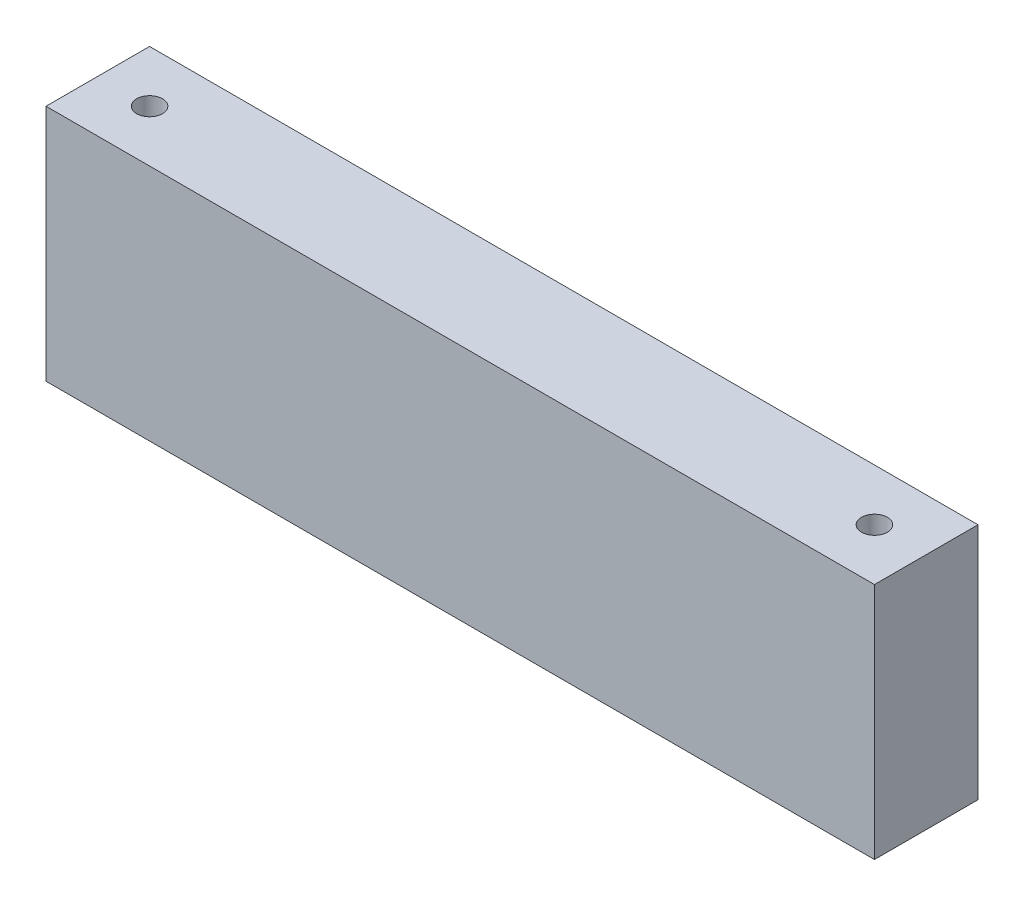
ISO-10303-21;
HEADER;
FILE_DESCRIPTION(('STEP AP214'),'2;1');
FILE_NAME('part.step','',(''),(''),'','','');
FILE_SCHEMA(('AUTOMOTIVE_DESIGN { 1 0 10303 214 1 1 1 1 }'));
ENDSEC;
DATA;
#1=APPLICATION_CONTEXT('core data for automotive mechanical design processes');
#2=APPLICATION_PROTOCOL_DEFINITION('international standard','automotive_design',2000,#1);
#3=PRODUCT_CONTEXT('',#1,'mechanical');
#4=PRODUCT('Part','Part','',(#3));
#5=PRODUCT_RELATED_PRODUCT_CATEGORY('part','',(#4));
#6=PRODUCT_DEFINITION_FORMATION('','',#4);
#7=PRODUCT_DEFINITION_CONTEXT('part definition',#1,'design');
#8=PRODUCT_DEFINITION('design','',#6,#7);
#9=PRODUCT_DEFINITION_SHAPE('','',#8);
#10=(LENGTH_UNIT() NAMED_UNIT(*) SI_UNIT(.MILLI.,.METRE.));
#11=(NAMED_UNIT(*) PLANE_ANGLE_UNIT() SI_UNIT($,.RADIAN.));
#12=(NAMED_UNIT(*) SI_UNIT($,.STERADIAN.) SOLID_ANGLE_UNIT());
#13=UNCERTAINTY_MEASURE_WITH_UNIT(LENGTH_MEASURE(1.E-05),#10,'distance_accuracy_value','');
#14=(GEOMETRIC_REPRESENTATION_CONTEXT(3) GLOBAL_UNCERTAINTY_ASSIGNED_CONTEXT((#13)) GLOBAL_UNIT_ASSIGNED_CONTEXT((#10,
#11,#12)) REPRESENTATION_CONTEXT('',''));
#15=CARTESIAN_POINT('',(0.,0.,0.));
#16=DIRECTION('',(0.,0.,1.));
#17=DIRECTION('',(1.,0.,0.));
#18=AXIS2_PLACEMENT_3D('',#15,#16,#17);
#19=CARTESIAN_POINT('',(50.8,-14.605,12.7));
#20=DIRECTION('',(-1.,0.,0.));
#21=DIRECTION('',(0.,0.,1.));
#22=AXIS2_PLACEMENT_3D('',#19,#20,#21);
#23=PLANE('',#22);
#24=DIRECTION('',(0.,1.,0.));
#25=VECTOR('',#24,1.);
#26=CARTESIAN_POINT('',(50.8,-14.605,0.));
#27=LINE('',#26,#25);
#28=CARTESIAN_POINT('',(50.8,-14.605,0.));
#29=VERTEX_POINT('',#28);
#30=CARTESIAN_POINT('',(50.8,14.605,0.));
#31=VERTEX_POINT('',#30);
#32=EDGE_CURVE('E96',#29,#31,#27,.T.);
#33=ORIENTED_EDGE('',*,*,#32,.T.);
#34=DIRECTION('',(0.,0.,-1.));
#35=VECTOR('',#34,1.);
#36=CARTESIAN_POINT('',(50.8,14.605,12.7));
#37=LINE('',#36,#35);
#38=CARTESIAN_POINT('',(50.8,14.605,12.7));
#39=VERTEX_POINT('',#38);
#40=EDGE_CURVE('E11',#39,#31,#37,.T.);
#41=ORIENTED_EDGE('',*,*,#40,.F.);
#42=DIRECTION('',(0.,1.,0.));
#43=VECTOR('',#42,1.);
#44=CARTESIAN_POINT('',(50.8,-14.605,12.7));
#45=LINE('',#44,#43);
#46=CARTESIAN_POINT('',(50.8,-14.605,12.7));
#47=VERTEX_POINT('',#46);
#48=EDGE_CURVE('E84',#47,#39,#45,.T.);
#49=ORIENTED_EDGE('',*,*,#48,.F.);
#50=DIRECTION('',(0.,0.,-1.));
#51=VECTOR('',#50,1.);
#52=CARTESIAN_POINT('',(50.8,-14.605,12.7));
#53=LINE('',#52,#51);
#54=EDGE_CURVE('E92',#47,#29,#53,.T.);
#55=ORIENTED_EDGE('',*,*,#54,.T.);
#56=EDGE_LOOP('',(#33,#41,#49,#55));
#57=FACE_BOUND('',#56,.T.);
#58=ADVANCED_FACE('F33',(#57),#23,.F.);
#59=CARTESIAN_POINT('',(-50.8,14.605,12.7));
#60=DIRECTION('',(0.,-1.,0.));
#61=DIRECTION('',(0.,0.,-1.));
#62=AXIS2_PLACEMENT_3D('',#59,#60,#61);
#63=PLANE('',#62);
#64=CARTESIAN_POINT('',(44.45,14.605,6.35000000000001));
#65=DIRECTION('',(0.,1.,0.));
#66=DIRECTION('',(0.,0.,1.));
#67=AXIS2_PLACEMENT_3D('',#64,#65,#66);
#68=CIRCLE('',#67,1.5875);
#69=CARTESIAN_POINT('',(44.45,14.605,7.93750000000001));
#70=VERTEX_POINT('',#69);
#71=EDGE_CURVE('E116',#70,#70,#68,.T.);
#72=ORIENTED_EDGE('',*,*,#71,.F.);
#73=EDGE_LOOP('',(#72));
#74=FACE_BOUND('',#73,.T.);
#75=CARTESIAN_POINT('',(-44.45,14.605,6.35000000000001));
#76=DIRECTION('',(0.,1.,0.));
#77=DIRECTION('',(0.,0.,1.));
#78=AXIS2_PLACEMENT_3D('',#75,#76,#77);
#79=CIRCLE('',#78,1.5875);
#80=CARTESIAN_POINT('',(-44.45,14.605,7.93750000000001));
#81=VERTEX_POINT('',#80);
#82=EDGE_CURVE('E110',#81,#81,#79,.T.);
#83=ORIENTED_EDGE('',*,*,#82,.F.);
#84=EDGE_LOOP('',(#83));
#85=FACE_BOUND('',#84,.T.);
#86=DIRECTION('',(-1.,0.,0.));
#87=VECTOR('',#86,1.);
#88=CARTESIAN_POINT('',(-50.8,14.605,0.));
#89=LINE('',#88,#87);
#90=CARTESIAN_POINT('',(-50.8,14.605,0.));
#91=VERTEX_POINT('',#90);
#92=EDGE_CURVE('E88',#31,#91,#89,.T.);
#93=ORIENTED_EDGE('',*,*,#92,.T.);
#94=DIRECTION('',(0.,0.,-1.));
#95=VECTOR('',#94,1.);
#96=CARTESIAN_POINT('',(-50.8,14.605,12.7));
#97=LINE('',#96,#95);
#98=CARTESIAN_POINT('',(-50.8,14.605,12.7));
#99=VERTEX_POINT('',#98);
#100=EDGE_CURVE('E41',#99,#91,#97,.T.);
#101=ORIENTED_EDGE('',*,*,#100,.F.);
#102=DIRECTION('',(-1.,0.,0.));
#103=VECTOR('',#102,1.);
#104=CARTESIAN_POINT('',(-50.8,14.605,12.7));
#105=LINE('',#104,#103);
#106=EDGE_CURVE('E79',#39,#99,#105,.T.);
#107=ORIENTED_EDGE('',*,*,#106,.F.);
#108=ORIENTED_EDGE('',*,*,#40,.T.);
#109=EDGE_LOOP('',(#93,#101,#107,#108));
#110=FACE_BOUND('',#109,.T.);
#111=ADVANCED_FACE('F87',(#74,#85,#110),#63,.F.);
#112=CARTESIAN_POINT('',(-50.8,-14.605,12.7));
#113=DIRECTION('',(1.,0.,0.));
#114=DIRECTION('',(0.,0.,-1.));
#115=AXIS2_PLACEMENT_3D('',#112,#113,#114);
#116=PLANE('',#115);
#117=DIRECTION('',(0.,-1.,0.));
#118=VECTOR('',#117,1.);
#119=CARTESIAN_POINT('',(-50.8,-14.605,0.));
#120=LINE('',#119,#118);
#121=CARTESIAN_POINT('',(-50.8,-14.605,0.));
#122=VERTEX_POINT('',#121);
#123=EDGE_CURVE('E66',#91,#122,#120,.T.);
#124=ORIENTED_EDGE('',*,*,#123,.T.);
#125=DIRECTION('',(0.,0.,-1.));
#126=VECTOR('',#125,1.);
#127=CARTESIAN_POINT('',(-50.8,-14.605,12.7));
#128=LINE('',#127,#126);
#129=CARTESIAN_POINT('',(-50.8,-14.605,12.7));
#130=VERTEX_POINT('',#129);
#131=EDGE_CURVE('E89',#130,#122,#128,.T.);
#132=ORIENTED_EDGE('',*,*,#131,.F.);
#133=DIRECTION('',(0.,-1.,0.));
#134=VECTOR('',#133,1.);
#135=CARTESIAN_POINT('',(-50.8,-14.605,12.7));
#136=LINE('',#135,#134);
#137=EDGE_CURVE('E82',#99,#130,#136,.T.);
#138=ORIENTED_EDGE('',*,*,#137,.F.);
#139=ORIENTED_EDGE('',*,*,#100,.T.);
#140=EDGE_LOOP('',(#124,#132,#138,#139));
#141=FACE_BOUND('',#140,.T.);
#142=ADVANCED_FACE('F90',(#141),#116,.F.);
#143=CARTESIAN_POINT('',(-50.8,-14.605,12.7));
#144=DIRECTION('',(0.,1.,0.));
#145=DIRECTION('',(0.,0.,1.));
#146=AXIS2_PLACEMENT_3D('',#143,#144,#145);
#147=PLANE('',#146);
#148=CARTESIAN_POINT('',(44.45,-14.605,6.35000000000001));
#149=DIRECTION('',(0.,1.,0.));
#150=DIRECTION('',(0.,0.,1.));
#151=AXIS2_PLACEMENT_3D('',#148,#149,#150);
#152=CIRCLE('',#151,1.5875);
#153=CARTESIAN_POINT('',(44.45,-14.605,7.93750000000001));
#154=VERTEX_POINT('',#153);
#155=EDGE_CURVE('E113',#154,#154,#152,.T.);
#156=ORIENTED_EDGE('',*,*,#155,.T.);
#157=EDGE_LOOP('',(#156));
#158=FACE_BOUND('',#157,.T.);
#159=CARTESIAN_POINT('',(-44.45,-14.605,6.35000000000001));
#160=DIRECTION('',(0.,1.,0.));
#161=DIRECTION('',(0.,0.,1.));
#162=AXIS2_PLACEMENT_3D('',#159,#160,#161);
#163=CIRCLE('',#162,1.5875);
#164=CARTESIAN_POINT('',(-44.45,-14.605,7.93750000000001));
#165=VERTEX_POINT('',#164);
#166=EDGE_CURVE('E99',#165,#165,#163,.T.);
#167=ORIENTED_EDGE('',*,*,#166,.T.);
#168=EDGE_LOOP('',(#167));
#169=FACE_BOUND('',#168,.T.);
#170=DIRECTION('',(1.,0.,0.));
#171=VECTOR('',#170,1.);
#172=CARTESIAN_POINT('',(-50.8,-14.605,0.));
#173=LINE('',#172,#171);
#174=EDGE_CURVE('E72',#122,#29,#173,.T.);
#175=ORIENTED_EDGE('',*,*,#174,.T.);
#176=ORIENTED_EDGE('',*,*,#54,.F.);
#177=DIRECTION('',(1.,0.,0.));
#178=VECTOR('',#177,1.);
#179=CARTESIAN_POINT('',(-50.8,-14.605,12.7));
#180=LINE('',#179,#178);
#181=EDGE_CURVE('E49',#130,#47,#180,.T.);
#182=ORIENTED_EDGE('',*,*,#181,.F.);
#183=ORIENTED_EDGE('',*,*,#131,.T.);
#184=EDGE_LOOP('',(#175,#176,#182,#183));
#185=FACE_BOUND('',#184,.T.);
#186=ADVANCED_FACE('F104',(#158,#169,#185),#147,.F.);
#187=CARTESIAN_POINT('',(0.,0.,12.7));
#188=DIRECTION('',(0.,0.,-1.));
#189=DIRECTION('',(-1.,0.,0.));
#190=AXIS2_PLACEMENT_3D('',#187,#188,#189);
#191=PLANE('',#190);
#192=ORIENTED_EDGE('',*,*,#48,.T.);
#193=ORIENTED_EDGE('',*,*,#106,.T.);
#194=ORIENTED_EDGE('',*,*,#137,.T.);
#195=ORIENTED_EDGE('',*,*,#181,.T.);
#196=EDGE_LOOP('',(#192,#193,#194,#195));
#197=FACE_BOUND('',#196,.T.);
#198=ADVANCED_FACE('F80',(#197),#191,.F.);
#199=CARTESIAN_POINT('',(0.,0.,0.));
#200=DIRECTION('',(0.,0.,-1.));
#201=DIRECTION('',(-1.,0.,0.));
#202=AXIS2_PLACEMENT_3D('',#199,#200,#201);
#203=PLANE('',#202);
#204=ORIENTED_EDGE('',*,*,#32,.F.);
#205=ORIENTED_EDGE('',*,*,#174,.F.);
#206=ORIENTED_EDGE('',*,*,#123,.F.);
#207=ORIENTED_EDGE('',*,*,#92,.F.);
#208=EDGE_LOOP('',(#204,#205,#206,#207));
#209=FACE_BOUND('',#208,.T.);
#210=ADVANCED_FACE('F107',(#209),#203,.T.);
#211=CARTESIAN_POINT('',(-44.45,-14.605,6.35000000000001));
#212=DIRECTION('',(0.,1.,0.));
#213=DIRECTION('',(0.,0.,1.));
#214=AXIS2_PLACEMENT_3D('',#211,#212,#213);
#215=CYLINDRICAL_SURFACE('',#214,1.5875);
#216=CARTESIAN_POINT('',(-44.45,-14.605,7.93750000000001));
#217=CARTESIAN_POINT('',(-44.45,-14.3007291666667,7.93750000000001));
#218=CARTESIAN_POINT('',(-44.45,-13.9964583333333,7.93750000000001));
#219=CARTESIAN_POINT('',(-44.45,-13.3879166666667,7.93750000000001));
#220=CARTESIAN_POINT('',(-44.45,-13.0836458333333,7.93750000000001));
#221=CARTESIAN_POINT('',(-44.45,-12.4751041666667,7.93750000000001));
#222=CARTESIAN_POINT('',(-44.45,-12.1708333333333,7.93750000000001));
#223=CARTESIAN_POINT('',(-44.45,-11.5622916666667,7.93750000000001));
#224=CARTESIAN_POINT('',(-44.45,-11.2580208333333,7.93750000000001));
#225=CARTESIAN_POINT('',(-44.45,-10.6494791666667,7.93750000000001));
#226=CARTESIAN_POINT('',(-44.45,-10.3452083333333,7.93750000000001));
#227=CARTESIAN_POINT('',(-44.45,-9.73666666666667,7.93750000000001));
#228=CARTESIAN_POINT('',(-44.45,-9.43239583333333,7.93750000000001));
#229=CARTESIAN_POINT('',(-44.45,-8.82385416666667,7.93750000000001));
#230=CARTESIAN_POINT('',(-44.45,-8.51958333333333,7.93750000000001));
#231=CARTESIAN_POINT('',(-44.45,-7.91104166666667,7.93750000000001));
#232=CARTESIAN_POINT('',(-44.45,-7.60677083333333,7.93750000000001));
#233=CARTESIAN_POINT('',(-44.45,-6.99822916666667,7.93750000000001));
#234=CARTESIAN_POINT('',(-44.45,-6.69395833333333,7.93750000000001));
#235=CARTESIAN_POINT('',(-44.45,-6.08541666666667,7.93750000000001));
#236=CARTESIAN_POINT('',(-44.45,-5.78114583333333,7.93750000000001));
#237=CARTESIAN_POINT('',(-44.45,-5.17260416666667,7.93750000000001));
#238=CARTESIAN_POINT('',(-44.45,-4.86833333333333,7.93750000000001));
#239=CARTESIAN_POINT('',(-44.45,-4.25979166666667,7.93750000000001));
#240=CARTESIAN_POINT('',(-44.45,-3.95552083333334,7.93750000000001));
#241=CARTESIAN_POINT('',(-44.45,-3.34697916666667,7.93750000000001));
#242=CARTESIAN_POINT('',(-44.45,-3.04270833333333,7.93750000000001));
#243=CARTESIAN_POINT('',(-44.45,-2.43416666666667,7.93750000000001));
#244=CARTESIAN_POINT('',(-44.45,-2.12989583333334,7.93750000000001));
#245=CARTESIAN_POINT('',(-44.45,-1.52135416666667,7.93750000000001));
#246=CARTESIAN_POINT('',(-44.45,-1.21708333333334,7.93750000000001));
#247=CARTESIAN_POINT('',(-44.45,-0.608541666666669,7.93750000000001));
#248=CARTESIAN_POINT('',(-44.45,-0.304270833333335,7.93750000000001));
#249=CARTESIAN_POINT('',(-44.45,0.304270833333332,7.93750000000001));
#250=CARTESIAN_POINT('',(-44.45,0.608541666666665,7.93750000000001));
#251=CARTESIAN_POINT('',(-44.45,1.21708333333333,7.93750000000001));
#252=CARTESIAN_POINT('',(-44.45,1.52135416666667,7.93750000000001));
#253=CARTESIAN_POINT('',(-44.45,2.12989583333333,7.93750000000001));
#254=CARTESIAN_POINT('',(-44.45,2.43416666666666,7.93750000000001));
#255=CARTESIAN_POINT('',(-44.45,3.04270833333333,7.93750000000001));
#256=CARTESIAN_POINT('',(-44.45,3.34697916666667,7.93750000000001));
#257=CARTESIAN_POINT('',(-44.45,3.95552083333333,7.93750000000001));
#258=CARTESIAN_POINT('',(-44.45,4.25979166666667,7.93750000000001));
#259=CARTESIAN_POINT('',(-44.45,4.86833333333333,7.93750000000001));
#260=CARTESIAN_POINT('',(-44.45,5.17260416666667,7.93750000000001));
#261=CARTESIAN_POINT('',(-44.45,5.78114583333333,7.93750000000001));
#262=CARTESIAN_POINT('',(-44.45,6.08541666666667,7.93750000000001));
#263=CARTESIAN_POINT('',(-44.45,6.69395833333333,7.93750000000001));
#264=CARTESIAN_POINT('',(-44.45,6.99822916666667,7.93750000000001));
#265=CARTESIAN_POINT('',(-44.45,7.60677083333333,7.93750000000001));
#266=CARTESIAN_POINT('',(-44.45,7.91104166666666,7.93750000000001));
#267=CARTESIAN_POINT('',(-44.45,8.51958333333333,7.93750000000001));
#268=CARTESIAN_POINT('',(-44.45,8.82385416666667,7.93750000000001));
#269=CARTESIAN_POINT('',(-44.45,9.43239583333333,7.93750000000001));
#270=CARTESIAN_POINT('',(-44.45,9.73666666666666,7.93750000000001));
#271=CARTESIAN_POINT('',(-44.45,10.3452083333333,7.93750000000001));
#272=CARTESIAN_POINT('',(-44.45,10.6494791666667,7.93750000000001));
#273=CARTESIAN_POINT('',(-44.45,11.2580208333333,7.93750000000001));
#274=CARTESIAN_POINT('',(-44.45,11.5622916666667,7.93750000000001));
#275=CARTESIAN_POINT('',(-44.45,12.1708333333333,7.93750000000001));
#276=CARTESIAN_POINT('',(-44.45,12.4751041666667,7.93750000000001));
#277=CARTESIAN_POINT('',(-44.45,13.0836458333333,7.93750000000001));
#278=CARTESIAN_POINT('',(-44.45,13.3879166666667,7.93750000000001));
#279=CARTESIAN_POINT('',(-44.45,13.9964583333333,7.93750000000001));
#280=CARTESIAN_POINT('',(-44.45,14.3007291666667,7.93750000000001));
#281=CARTESIAN_POINT('',(-44.45,14.605,7.93750000000001));
#282=B_SPLINE_CURVE_WITH_KNOTS('',3,(#216,#217,#218,#219,#220,#221,#222,#223,#224,#225,#226,
#227,#228,#229,#230,#231,#232,#233,#234,#235,#236,#237,#238,#239,#240,#241,#242,#243,#244,#245,
#246,#247,#248,#249,#250,#251,#252,#253,#254,#255,#256,#257,#258,#259,#260,#261,#262,#263,#264,
#265,#266,#267,#268,#269,#270,#271,#272,#273,#274,#275,#276,#277,#278,#279,#280,#281),
.UNSPECIFIED.,.F.,.F.,(4,2,2,2,2,2,2,2,2,2,2,2,2,2,2,2,2,2,2,2,2,2,2,2,2,2,2,2,2,2,2,2,4),(0.,
0.9128125,1.825625,2.7384375,3.65125,4.5640625,5.476875,6.3896875,7.3025,8.2153125,9.128125,
10.0409375,10.95375,11.8665625,12.779375,13.6921875,14.605,15.5178125,16.430625,17.3434375,
18.25625,19.1690625,20.081875,20.9946875,21.9075,22.8203125,23.733125,24.6459375,25.55875,
26.4715625,27.384375,28.2971875,29.21),.UNSPECIFIED.);
#283=EDGE_CURVE('BSEAM127',#165,#81,#282,.T.);
#284=ORIENTED_EDGE('',*,*,#166,.F.);
#285=ORIENTED_EDGE('',*,*,#82,.T.);
#286=ORIENTED_EDGE('',*,*,#283,.T.);
#287=ORIENTED_EDGE('',*,*,#283,.F.);
#288=EDGE_LOOP('',(#284,#286,#285,#287));
#289=FACE_BOUND('',#288,.T.);
#290=ADVANCED_FACE('F127',(#289),#215,.F.);
#291=CARTESIAN_POINT('',(44.45,-14.605,6.35000000000001));
#292=DIRECTION('',(0.,1.,0.));
#293=DIRECTION('',(0.,0.,1.));
#294=AXIS2_PLACEMENT_3D('',#291,#292,#293);
#295=CYLINDRICAL_SURFACE('',#294,1.5875);
#296=CARTESIAN_POINT('',(44.45,-14.605,7.93750000000001));
#297=CARTESIAN_POINT('',(44.45,-14.3007291666667,7.93750000000001));
#298=CARTESIAN_POINT('',(44.45,-13.9964583333333,7.93750000000001));
#299=CARTESIAN_POINT('',(44.45,-13.3879166666667,7.93750000000001));
#300=CARTESIAN_POINT('',(44.45,-13.0836458333333,7.93750000000001));
#301=CARTESIAN_POINT('',(44.45,-12.4751041666667,7.93750000000001));
#302=CARTESIAN_POINT('',(44.45,-12.1708333333333,7.93750000000001));
#303=CARTESIAN_POINT('',(44.45,-11.5622916666667,7.93750000000001));
#304=CARTESIAN_POINT('',(44.45,-11.2580208333333,7.93750000000001));
#305=CARTESIAN_POINT('',(44.45,-10.6494791666667,7.93750000000001));
#306=CARTESIAN_POINT('',(44.45,-10.3452083333333,7.93750000000001));
#307=CARTESIAN_POINT('',(44.45,-9.73666666666667,7.93750000000001));
#308=CARTESIAN_POINT('',(44.45,-9.43239583333333,7.93750000000001));
#309=CARTESIAN_POINT('',(44.45,-8.82385416666667,7.93750000000001));
#310=CARTESIAN_POINT('',(44.45,-8.51958333333333,7.93750000000001));
#311=CARTESIAN_POINT('',(44.45,-7.91104166666667,7.93750000000001));
#312=CARTESIAN_POINT('',(44.45,-7.60677083333333,7.93750000000001));
#313=CARTESIAN_POINT('',(44.45,-6.99822916666667,7.93750000000001));
#314=CARTESIAN_POINT('',(44.45,-6.69395833333333,7.93750000000001));
#315=CARTESIAN_POINT('',(44.45,-6.08541666666667,7.93750000000001));
#316=CARTESIAN_POINT('',(44.45,-5.78114583333333,7.93750000000001));
#317=CARTESIAN_POINT('',(44.45,-5.17260416666667,7.93750000000001));
#318=CARTESIAN_POINT('',(44.45,-4.86833333333333,7.93750000000001));
#319=CARTESIAN_POINT('',(44.45,-4.25979166666667,7.93750000000001));
#320=CARTESIAN_POINT('',(44.45,-3.95552083333334,7.93750000000001));
#321=CARTESIAN_POINT('',(44.45,-3.34697916666667,7.93750000000001));
#322=CARTESIAN_POINT('',(44.45,-3.04270833333333,7.93750000000001));
#323=CARTESIAN_POINT('',(44.45,-2.43416666666667,7.93750000000001));
#324=CARTESIAN_POINT('',(44.45,-2.12989583333334,7.93750000000001));
#325=CARTESIAN_POINT('',(44.45,-1.52135416666667,7.93750000000001));
#326=CARTESIAN_POINT('',(44.45,-1.21708333333334,7.93750000000001));
#327=CARTESIAN_POINT('',(44.45,-0.608541666666669,7.93750000000001));
#328=CARTESIAN_POINT('',(44.45,-0.304270833333335,7.93750000000001));
#329=CARTESIAN_POINT('',(44.45,0.304270833333332,7.93750000000001));
#330=CARTESIAN_POINT('',(44.45,0.608541666666665,7.93750000000001));
#331=CARTESIAN_POINT('',(44.45,1.21708333333333,7.93750000000001));
#332=CARTESIAN_POINT('',(44.45,1.52135416666667,7.93750000000001));
#333=CARTESIAN_POINT('',(44.45,2.12989583333333,7.93750000000001));
#334=CARTESIAN_POINT('',(44.45,2.43416666666666,7.93750000000001));
#335=CARTESIAN_POINT('',(44.45,3.04270833333333,7.93750000000001));
#336=CARTESIAN_POINT('',(44.45,3.34697916666667,7.93750000000001));
#337=CARTESIAN_POINT('',(44.45,3.95552083333333,7.93750000000001));
#338=CARTESIAN_POINT('',(44.45,4.25979166666667,7.93750000000001));
#339=CARTESIAN_POINT('',(44.45,4.86833333333333,7.93750000000001));
#340=CARTESIAN_POINT('',(44.45,5.17260416666667,7.93750000000001));
#341=CARTESIAN_POINT('',(44.45,5.78114583333333,7.93750000000001));
#342=CARTESIAN_POINT('',(44.45,6.08541666666667,7.93750000000001));
#343=CARTESIAN_POINT('',(44.45,6.69395833333333,7.93750000000001));
#344=CARTESIAN_POINT('',(44.45,6.99822916666667,7.93750000000001));
#345=CARTESIAN_POINT('',(44.45,7.60677083333333,7.93750000000001));
#346=CARTESIAN_POINT('',(44.45,7.91104166666666,7.93750000000001));
#347=CARTESIAN_POINT('',(44.45,8.51958333333333,7.93750000000001));
#348=CARTESIAN_POINT('',(44.45,8.82385416666667,7.93750000000001));
#349=CARTESIAN_POINT('',(44.45,9.43239583333333,7.93750000000001));
#350=CARTESIAN_POINT('',(44.45,9.73666666666666,7.93750000000001));
#351=CARTESIAN_POINT('',(44.45,10.3452083333333,7.93750000000001));
#352=CARTESIAN_POINT('',(44.45,10.6494791666667,7.93750000000001));
#353=CARTESIAN_POINT('',(44.45,11.2580208333333,7.93750000000001));
#354=CARTESIAN_POINT('',(44.45,11.5622916666667,7.93750000000001));
#355=CARTESIAN_POINT('',(44.45,12.1708333333333,7.93750000000001));
#356=CARTESIAN_POINT('',(44.45,12.4751041666667,7.93750000000001));
#357=CARTESIAN_POINT('',(44.45,13.0836458333333,7.93750000000001));
#358=CARTESIAN_POINT('',(44.45,13.3879166666667,7.93750000000001));
#359=CARTESIAN_POINT('',(44.45,13.9964583333333,7.93750000000001));
#360=CARTESIAN_POINT('',(44.45,14.3007291666667,7.93750000000001));
#361=CARTESIAN_POINT('',(44.45,14.605,7.93750000000001));
#362=B_SPLINE_CURVE_WITH_KNOTS('',3,(#296,#297,#298,#299,#300,#301,#302,#303,#304,#305,#306,
#307,#308,#309,#310,#311,#312,#313,#314,#315,#316,#317,#318,#319,#320,#321,#322,#323,#324,#325,
#326,#327,#328,#329,#330,#331,#332,#333,#334,#335,#336,#337,#338,#339,#340,#341,#342,#343,#344,
#345,#346,#347,#348,#349,#350,#351,#352,#353,#354,#355,#356,#357,#358,#359,#360,#361),
.UNSPECIFIED.,.F.,.F.,(4,2,2,2,2,2,2,2,2,2,2,2,2,2,2,2,2,2,2,2,2,2,2,2,2,2,2,2,2,2,2,2,4),(0.,
0.9128125,1.825625,2.7384375,3.65125,4.5640625,5.476875,6.3896875,7.3025,8.2153125,9.128125,
10.0409375,10.95375,11.8665625,12.779375,13.6921875,14.605,15.5178125,16.430625,17.3434375,
18.25625,19.1690625,20.081875,20.9946875,21.9075,22.8203125,23.733125,24.6459375,25.55875,
26.4715625,27.384375,28.2971875,29.21),.UNSPECIFIED.);
#363=EDGE_CURVE('BSEAM124',#154,#70,#362,.T.);
#364=ORIENTED_EDGE('',*,*,#155,.F.);
#365=ORIENTED_EDGE('',*,*,#71,.T.);
#366=ORIENTED_EDGE('',*,*,#363,.T.);
#367=ORIENTED_EDGE('',*,*,#363,.F.);
#368=EDGE_LOOP('',(#364,#366,#365,#367));
#369=FACE_BOUND('',#368,.T.);
#370=ADVANCED_FACE('F124',(#369),#295,.F.);
#371=CLOSED_SHELL('',(#58,#111,#142,#186,#198,#210,#290,#370));
#372=MANIFOLD_SOLID_BREP('B2',#371);
#373=ADVANCED_BREP_SHAPE_REPRESENTATION('',(#18,#372),#14);
#374=SHAPE_DEFINITION_REPRESENTATION(#9,#373);
ENDSEC;
END-ISO-10303-21;
